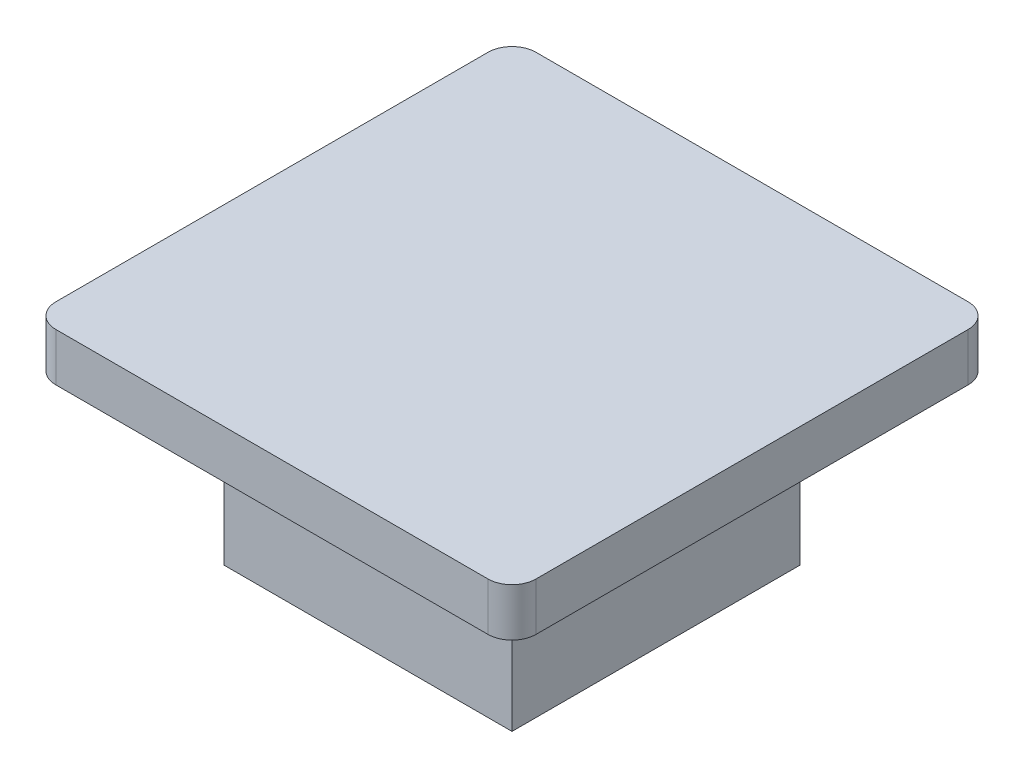
ISO-10303-21;
HEADER;
FILE_DESCRIPTION(('STEP AP214'),'2;1');
FILE_NAME('part.step','',(''),(''),'','','');
FILE_SCHEMA(('AUTOMOTIVE_DESIGN { 1 0 10303 214 1 1 1 1 }'));
ENDSEC;
DATA;
#1=APPLICATION_CONTEXT('core data for automotive mechanical design processes');
#2=APPLICATION_PROTOCOL_DEFINITION('international standard','automotive_design',2000,#1);
#3=PRODUCT_CONTEXT('',#1,'mechanical');
#4=PRODUCT('Part','Part','',(#3));
#5=PRODUCT_RELATED_PRODUCT_CATEGORY('part','',(#4));
#6=PRODUCT_DEFINITION_FORMATION('','',#4);
#7=PRODUCT_DEFINITION_CONTEXT('part definition',#1,'design');
#8=PRODUCT_DEFINITION('design','',#6,#7);
#9=PRODUCT_DEFINITION_SHAPE('','',#8);
#10=(LENGTH_UNIT() NAMED_UNIT(*) SI_UNIT(.MILLI.,.METRE.));
#11=(NAMED_UNIT(*) PLANE_ANGLE_UNIT() SI_UNIT($,.RADIAN.));
#12=(NAMED_UNIT(*) SI_UNIT($,.STERADIAN.) SOLID_ANGLE_UNIT());
#13=UNCERTAINTY_MEASURE_WITH_UNIT(LENGTH_MEASURE(1.E-05),#10,'distance_accuracy_value','');
#14=(GEOMETRIC_REPRESENTATION_CONTEXT(3) GLOBAL_UNCERTAINTY_ASSIGNED_CONTEXT((#13)) GLOBAL_UNIT_ASSIGNED_CONTEXT((#10,
#11,#12)) REPRESENTATION_CONTEXT('',''));
#15=CARTESIAN_POINT('',(0.,0.,0.));
#16=DIRECTION('',(0.,0.,1.));
#17=DIRECTION('',(1.,0.,0.));
#18=AXIS2_PLACEMENT_3D('',#15,#16,#17);
#19=CARTESIAN_POINT('',(100.,20.,100.));
#20=DIRECTION('',(-1.,0.,0.));
#21=DIRECTION('',(0.,0.,1.));
#22=AXIS2_PLACEMENT_3D('',#19,#20,#21);
#23=PLANE('',#22);
#24=DIRECTION('',(0.,0.,-1.));
#25=VECTOR('',#24,1.);
#26=CARTESIAN_POINT('',(100.,20.,100.));
#27=LINE('',#26,#25);
#28=CARTESIAN_POINT('',(100.,20.,90.));
#29=VERTEX_POINT('',#28);
#30=CARTESIAN_POINT('',(100.,20.,-90.));
#31=VERTEX_POINT('',#30);
#32=EDGE_CURVE('E229',#29,#31,#27,.T.);
#33=ORIENTED_EDGE('',*,*,#32,.F.);
#34=DIRECTION('',(0.,-1.,0.));
#35=VECTOR('',#34,1.);
#36=CARTESIAN_POINT('',(100.,20.,90.));
#37=LINE('',#36,#35);
#38=CARTESIAN_POINT('',(100.,0.,90.));
#39=VERTEX_POINT('',#38);
#40=EDGE_CURVE('E285',#29,#39,#37,.T.);
#41=ORIENTED_EDGE('',*,*,#40,.T.);
#42=DIRECTION('',(0.,0.,-1.));
#43=VECTOR('',#42,1.);
#44=CARTESIAN_POINT('',(100.,0.,100.));
#45=LINE('',#44,#43);
#46=CARTESIAN_POINT('',(100.,0.,-90.));
#47=VERTEX_POINT('',#46);
#48=EDGE_CURVE('E228',#39,#47,#45,.T.);
#49=ORIENTED_EDGE('',*,*,#48,.T.);
#50=DIRECTION('',(0.,-1.,0.));
#51=VECTOR('',#50,1.);
#52=CARTESIAN_POINT('',(100.,20.,-90.));
#53=LINE('',#52,#51);
#54=EDGE_CURVE('E283',#47,#31,#53,.F.);
#55=ORIENTED_EDGE('',*,*,#54,.T.);
#56=EDGE_LOOP('',(#33,#41,#49,#55));
#57=FACE_BOUND('',#56,.T.);
#58=ADVANCED_FACE('F37',(#57),#23,.F.);
#59=CARTESIAN_POINT('',(-100.,20.,-100.));
#60=DIRECTION('',(0.,0.,1.));
#61=DIRECTION('',(1.,0.,0.));
#62=AXIS2_PLACEMENT_3D('',#59,#60,#61);
#63=PLANE('',#62);
#64=DIRECTION('',(-1.,0.,0.));
#65=VECTOR('',#64,1.);
#66=CARTESIAN_POINT('',(-100.,0.,-100.));
#67=LINE('',#66,#65);
#68=CARTESIAN_POINT('',(90.,0.,-100.));
#69=VERTEX_POINT('',#68);
#70=CARTESIAN_POINT('',(-90.,0.,-100.));
#71=VERTEX_POINT('',#70);
#72=EDGE_CURVE('E245',#69,#71,#67,.T.);
#73=ORIENTED_EDGE('',*,*,#72,.T.);
#74=DIRECTION('',(0.,-1.,0.));
#75=VECTOR('',#74,1.);
#76=CARTESIAN_POINT('',(-90.,20.,-100.));
#77=LINE('',#76,#75);
#78=CARTESIAN_POINT('',(-90.,20.,-100.));
#79=VERTEX_POINT('',#78);
#80=EDGE_CURVE('E268',#71,#79,#77,.F.);
#81=ORIENTED_EDGE('',*,*,#80,.T.);
#82=DIRECTION('',(-1.,0.,0.));
#83=VECTOR('',#82,1.);
#84=CARTESIAN_POINT('',(-100.,20.,-100.));
#85=LINE('',#84,#83);
#86=CARTESIAN_POINT('',(90.,20.,-100.));
#87=VERTEX_POINT('',#86);
#88=EDGE_CURVE('E232',#87,#79,#85,.T.);
#89=ORIENTED_EDGE('',*,*,#88,.F.);
#90=DIRECTION('',(0.,-1.,0.));
#91=VECTOR('',#90,1.);
#92=CARTESIAN_POINT('',(90.,20.,-100.));
#93=LINE('',#92,#91);
#94=EDGE_CURVE('E265',#87,#69,#93,.T.);
#95=ORIENTED_EDGE('',*,*,#94,.T.);
#96=EDGE_LOOP('',(#73,#81,#89,#95));
#97=FACE_BOUND('',#96,.T.);
#98=ADVANCED_FACE('F354',(#97),#63,.F.);
#99=CARTESIAN_POINT('',(-100.,20.,100.));
#100=DIRECTION('',(1.,0.,0.));
#101=DIRECTION('',(0.,0.,-1.));
#102=AXIS2_PLACEMENT_3D('',#99,#100,#101);
#103=PLANE('',#102);
#104=DIRECTION('',(0.,0.,1.));
#105=VECTOR('',#104,1.);
#106=CARTESIAN_POINT('',(-100.,20.,100.));
#107=LINE('',#106,#105);
#108=CARTESIAN_POINT('',(-100.,20.,-90.));
#109=VERTEX_POINT('',#108);
#110=CARTESIAN_POINT('',(-100.,20.,90.));
#111=VERTEX_POINT('',#110);
#112=EDGE_CURVE('E236',#109,#111,#107,.T.);
#113=ORIENTED_EDGE('',*,*,#112,.F.);
#114=DIRECTION('',(0.,-1.,0.));
#115=VECTOR('',#114,1.);
#116=CARTESIAN_POINT('',(-100.,20.,-90.));
#117=LINE('',#116,#115);
#118=CARTESIAN_POINT('',(-100.,0.,-90.));
#119=VERTEX_POINT('',#118);
#120=EDGE_CURVE('E254',#109,#119,#117,.T.);
#121=ORIENTED_EDGE('',*,*,#120,.T.);
#122=DIRECTION('',(0.,0.,1.));
#123=VECTOR('',#122,1.);
#124=CARTESIAN_POINT('',(-100.,0.,100.));
#125=LINE('',#124,#123);
#126=CARTESIAN_POINT('',(-100.,0.,90.));
#127=VERTEX_POINT('',#126);
#128=EDGE_CURVE('E248',#119,#127,#125,.T.);
#129=ORIENTED_EDGE('',*,*,#128,.T.);
#130=DIRECTION('',(0.,-1.,0.));
#131=VECTOR('',#130,1.);
#132=CARTESIAN_POINT('',(-100.,20.,90.));
#133=LINE('',#132,#131);
#134=EDGE_CURVE('E242',#127,#111,#133,.F.);
#135=ORIENTED_EDGE('',*,*,#134,.T.);
#136=EDGE_LOOP('',(#113,#121,#129,#135));
#137=FACE_BOUND('',#136,.T.);
#138=ADVANCED_FACE('F360',(#137),#103,.F.);
#139=CARTESIAN_POINT('',(-100.,20.,100.));
#140=DIRECTION('',(0.,0.,-1.));
#141=DIRECTION('',(-1.,0.,0.));
#142=AXIS2_PLACEMENT_3D('',#139,#140,#141);
#143=PLANE('',#142);
#144=DIRECTION('',(1.,0.,0.));
#145=VECTOR('',#144,1.);
#146=CARTESIAN_POINT('',(-100.,20.,100.));
#147=LINE('',#146,#145);
#148=CARTESIAN_POINT('',(-90.,20.,100.));
#149=VERTEX_POINT('',#148);
#150=CARTESIAN_POINT('',(90.,20.,100.));
#151=VERTEX_POINT('',#150);
#152=EDGE_CURVE('E239',#149,#151,#147,.T.);
#153=ORIENTED_EDGE('',*,*,#152,.F.);
#154=DIRECTION('',(0.,-1.,0.));
#155=VECTOR('',#154,1.);
#156=CARTESIAN_POINT('',(-90.,20.,100.));
#157=LINE('',#156,#155);
#158=CARTESIAN_POINT('',(-90.,0.,100.));
#159=VERTEX_POINT('',#158);
#160=EDGE_CURVE('E280',#149,#159,#157,.T.);
#161=ORIENTED_EDGE('',*,*,#160,.T.);
#162=DIRECTION('',(1.,0.,0.));
#163=VECTOR('',#162,1.);
#164=CARTESIAN_POINT('',(-100.,0.,100.));
#165=LINE('',#164,#163);
#166=CARTESIAN_POINT('',(90.,0.,100.));
#167=VERTEX_POINT('',#166);
#168=EDGE_CURVE('E233',#159,#167,#165,.T.);
#169=ORIENTED_EDGE('',*,*,#168,.T.);
#170=DIRECTION('',(0.,-1.,0.));
#171=VECTOR('',#170,1.);
#172=CARTESIAN_POINT('',(90.,20.,100.));
#173=LINE('',#172,#171);
#174=EDGE_CURVE('E278',#167,#151,#173,.F.);
#175=ORIENTED_EDGE('',*,*,#174,.T.);
#176=EDGE_LOOP('',(#153,#161,#169,#175));
#177=FACE_BOUND('',#176,.T.);
#178=ADVANCED_FACE('F435',(#177),#143,.F.);
#179=CARTESIAN_POINT('',(0.,20.,0.));
#180=DIRECTION('',(0.,-1.,0.));
#181=DIRECTION('',(0.,0.,-1.));
#182=AXIS2_PLACEMENT_3D('',#179,#180,#181);
#183=PLANE('',#182);
#184=ORIENTED_EDGE('',*,*,#88,.T.);
#185=CARTESIAN_POINT('',(-90.,20.,-90.));
#186=DIRECTION('',(0.,-1.,0.));
#187=DIRECTION('',(0.,0.,-1.));
#188=AXIS2_PLACEMENT_3D('',#185,#186,#187);
#189=CIRCLE('',#188,10.);
#190=EDGE_CURVE('E276',#79,#109,#189,.F.);
#191=ORIENTED_EDGE('',*,*,#190,.T.);
#192=ORIENTED_EDGE('',*,*,#112,.T.);
#193=CARTESIAN_POINT('',(-90.,20.,90.));
#194=DIRECTION('',(0.,-1.,0.));
#195=DIRECTION('',(0.,0.,-1.));
#196=AXIS2_PLACEMENT_3D('',#193,#194,#195);
#197=CIRCLE('',#196,10.);
#198=EDGE_CURVE('E274',#111,#149,#197,.F.);
#199=ORIENTED_EDGE('',*,*,#198,.T.);
#200=ORIENTED_EDGE('',*,*,#152,.T.);
#201=CARTESIAN_POINT('',(90.,20.,90.));
#202=DIRECTION('',(0.,-1.,0.));
#203=DIRECTION('',(0.,0.,-1.));
#204=AXIS2_PLACEMENT_3D('',#201,#202,#203);
#205=CIRCLE('',#204,10.);
#206=EDGE_CURVE('E272',#151,#29,#205,.F.);
#207=ORIENTED_EDGE('',*,*,#206,.T.);
#208=ORIENTED_EDGE('',*,*,#32,.T.);
#209=CARTESIAN_POINT('',(90.,20.,-90.));
#210=DIRECTION('',(0.,-1.,0.));
#211=DIRECTION('',(0.,0.,-1.));
#212=AXIS2_PLACEMENT_3D('',#209,#210,#211);
#213=CIRCLE('',#212,10.);
#214=EDGE_CURVE('E270',#31,#87,#213,.F.);
#215=ORIENTED_EDGE('',*,*,#214,.T.);
#216=EDGE_LOOP('',(#184,#191,#192,#199,#200,#207,#208,#215));
#217=FACE_BOUND('',#216,.T.);
#218=ADVANCED_FACE('F432',(#217),#183,.F.);
#219=CARTESIAN_POINT('',(0.,0.,0.));
#220=DIRECTION('',(0.,-1.,0.));
#221=DIRECTION('',(0.,0.,-1.));
#222=AXIS2_PLACEMENT_3D('',#219,#220,#221);
#223=PLANE('',#222);
#224=DIRECTION('',(0.,0.,-1.));
#225=VECTOR('',#224,1.);
#226=CARTESIAN_POINT('',(-70.,0.,0.));
#227=LINE('',#226,#225);
#228=CARTESIAN_POINT('',(-70.,0.,-70.));
#229=VERTEX_POINT('',#228);
#230=CARTESIAN_POINT('',(-70.,0.,70.));
#231=VERTEX_POINT('',#230);
#232=EDGE_CURVE('E293',#229,#231,#227,.F.);
#233=ORIENTED_EDGE('',*,*,#232,.T.);
#234=DIRECTION('',(-1.,0.,0.));
#235=VECTOR('',#234,1.);
#236=CARTESIAN_POINT('',(0.,0.,70.));
#237=LINE('',#236,#235);
#238=CARTESIAN_POINT('',(70.,0.,70.));
#239=VERTEX_POINT('',#238);
#240=EDGE_CURVE('E297',#231,#239,#237,.F.);
#241=ORIENTED_EDGE('',*,*,#240,.T.);
#242=DIRECTION('',(0.,0.,1.));
#243=VECTOR('',#242,1.);
#244=CARTESIAN_POINT('',(70.,0.,0.));
#245=LINE('',#244,#243);
#246=CARTESIAN_POINT('',(70.,0.,-70.));
#247=VERTEX_POINT('',#246);
#248=EDGE_CURVE('E295',#239,#247,#245,.F.);
#249=ORIENTED_EDGE('',*,*,#248,.T.);
#250=DIRECTION('',(1.,0.,0.));
#251=VECTOR('',#250,1.);
#252=CARTESIAN_POINT('',(0.,0.,-70.));
#253=LINE('',#252,#251);
#254=EDGE_CURVE('E291',#247,#229,#253,.F.);
#255=ORIENTED_EDGE('',*,*,#254,.T.);
#256=EDGE_LOOP('',(#233,#241,#249,#255));
#257=FACE_BOUND('',#256,.T.);
#258=ORIENTED_EDGE('',*,*,#128,.F.);
#259=CARTESIAN_POINT('',(-90.,0.,-90.));
#260=DIRECTION('',(0.,-1.,0.));
#261=DIRECTION('',(0.,0.,-1.));
#262=AXIS2_PLACEMENT_3D('',#259,#260,#261);
#263=CIRCLE('',#262,10.);
#264=EDGE_CURVE('E263',#119,#71,#263,.T.);
#265=ORIENTED_EDGE('',*,*,#264,.T.);
#266=ORIENTED_EDGE('',*,*,#72,.F.);
#267=CARTESIAN_POINT('',(90.,0.,-90.));
#268=DIRECTION('',(0.,-1.,0.));
#269=DIRECTION('',(0.,0.,-1.));
#270=AXIS2_PLACEMENT_3D('',#267,#268,#269);
#271=CIRCLE('',#270,10.);
#272=EDGE_CURVE('E257',#69,#47,#271,.T.);
#273=ORIENTED_EDGE('',*,*,#272,.T.);
#274=ORIENTED_EDGE('',*,*,#48,.F.);
#275=CARTESIAN_POINT('',(90.,0.,90.));
#276=DIRECTION('',(0.,-1.,0.));
#277=DIRECTION('',(0.,0.,-1.));
#278=AXIS2_PLACEMENT_3D('',#275,#276,#277);
#279=CIRCLE('',#278,10.);
#280=EDGE_CURVE('E259',#39,#167,#279,.T.);
#281=ORIENTED_EDGE('',*,*,#280,.T.);
#282=ORIENTED_EDGE('',*,*,#168,.F.);
#283=CARTESIAN_POINT('',(-90.,0.,90.));
#284=DIRECTION('',(0.,-1.,0.));
#285=DIRECTION('',(0.,0.,-1.));
#286=AXIS2_PLACEMENT_3D('',#283,#284,#285);
#287=CIRCLE('',#286,10.);
#288=EDGE_CURVE('E261',#159,#127,#287,.T.);
#289=ORIENTED_EDGE('',*,*,#288,.T.);
#290=EDGE_LOOP('',(#258,#265,#266,#273,#274,#281,#282,#289));
#291=FACE_BOUND('',#290,.T.);
#292=ADVANCED_FACE('F400',(#257,#291),#223,.T.);
#293=CARTESIAN_POINT('',(60.,-70.,-60.));
#294=DIRECTION('',(-1.,0.,0.));
#295=DIRECTION('',(0.,0.,1.));
#296=AXIS2_PLACEMENT_3D('',#293,#294,#295);
#297=PLANE('',#296);
#298=DIRECTION('',(0.,1.,0.));
#299=VECTOR('',#298,1.);
#300=CARTESIAN_POINT('',(60.,-70.,-60.));
#301=LINE('',#300,#299);
#302=CARTESIAN_POINT('',(60.,-70.,-60.));
#303=VERTEX_POINT('',#302);
#304=CARTESIAN_POINT('',(60.,-10.,-60.));
#305=VERTEX_POINT('',#304);
#306=EDGE_CURVE('E219',#303,#305,#301,.T.);
#307=ORIENTED_EDGE('',*,*,#306,.T.);
#308=DIRECTION('',(0.,0.,1.));
#309=VECTOR('',#308,1.);
#310=CARTESIAN_POINT('',(60.,-10.,-60.));
#311=LINE('',#310,#309);
#312=CARTESIAN_POINT('',(60.,-10.,60.));
#313=VERTEX_POINT('',#312);
#314=EDGE_CURVE('E300',#305,#313,#311,.T.);
#315=ORIENTED_EDGE('',*,*,#314,.T.);
#316=DIRECTION('',(0.,1.,0.));
#317=VECTOR('',#316,1.);
#318=CARTESIAN_POINT('',(60.,-70.,60.));
#319=LINE('',#318,#317);
#320=CARTESIAN_POINT('',(60.,-70.,60.));
#321=VERTEX_POINT('',#320);
#322=EDGE_CURVE('E225',#321,#313,#319,.T.);
#323=ORIENTED_EDGE('',*,*,#322,.F.);
#324=DIRECTION('',(0.,0.,1.));
#325=VECTOR('',#324,1.);
#326=CARTESIAN_POINT('',(60.,-70.,-60.));
#327=LINE('',#326,#325);
#328=EDGE_CURVE('E207',#303,#321,#327,.T.);
#329=ORIENTED_EDGE('',*,*,#328,.F.);
#330=EDGE_LOOP('',(#307,#315,#323,#329));
#331=FACE_BOUND('',#330,.T.);
#332=ADVANCED_FACE('F406',(#331),#297,.F.);
#333=CARTESIAN_POINT('',(-60.,-70.,60.));
#334=DIRECTION('',(0.,0.,-1.));
#335=DIRECTION('',(-1.,0.,0.));
#336=AXIS2_PLACEMENT_3D('',#333,#334,#335);
#337=PLANE('',#336);
#338=ORIENTED_EDGE('',*,*,#322,.T.);
#339=DIRECTION('',(-1.,0.,0.));
#340=VECTOR('',#339,1.);
#341=CARTESIAN_POINT('',(-60.,-10.,60.));
#342=LINE('',#341,#340);
#343=CARTESIAN_POINT('',(-60.,-10.,60.));
#344=VERTEX_POINT('',#343);
#345=EDGE_CURVE('E288',#313,#344,#342,.T.);
#346=ORIENTED_EDGE('',*,*,#345,.T.);
#347=DIRECTION('',(0.,1.,0.));
#348=VECTOR('',#347,1.);
#349=CARTESIAN_POINT('',(-60.,-70.,60.));
#350=LINE('',#349,#348);
#351=CARTESIAN_POINT('',(-60.,-70.,60.));
#352=VERTEX_POINT('',#351);
#353=EDGE_CURVE('E223',#352,#344,#350,.T.);
#354=ORIENTED_EDGE('',*,*,#353,.F.);
#355=DIRECTION('',(-1.,0.,0.));
#356=VECTOR('',#355,1.);
#357=CARTESIAN_POINT('',(-60.,-70.,60.));
#358=LINE('',#357,#356);
#359=EDGE_CURVE('E213',#321,#352,#358,.T.);
#360=ORIENTED_EDGE('',*,*,#359,.F.);
#361=EDGE_LOOP('',(#338,#346,#354,#360));
#362=FACE_BOUND('',#361,.T.);
#363=ADVANCED_FACE('F409',(#362),#337,.F.);
#364=CARTESIAN_POINT('',(-60.,-70.,-60.));
#365=DIRECTION('',(1.,0.,0.));
#366=DIRECTION('',(0.,0.,-1.));
#367=AXIS2_PLACEMENT_3D('',#364,#365,#366);
#368=PLANE('',#367);
#369=ORIENTED_EDGE('',*,*,#353,.T.);
#370=DIRECTION('',(0.,0.,-1.));
#371=VECTOR('',#370,1.);
#372=CARTESIAN_POINT('',(-60.,-10.,-60.));
#373=LINE('',#372,#371);
#374=CARTESIAN_POINT('',(-60.,-10.,-60.));
#375=VERTEX_POINT('',#374);
#376=EDGE_CURVE('E46',#344,#375,#373,.T.);
#377=ORIENTED_EDGE('',*,*,#376,.T.);
#378=DIRECTION('',(0.,1.,0.));
#379=VECTOR('',#378,1.);
#380=CARTESIAN_POINT('',(-60.,-70.,-60.));
#381=LINE('',#380,#379);
#382=CARTESIAN_POINT('',(-60.,-70.,-60.));
#383=VERTEX_POINT('',#382);
#384=EDGE_CURVE('E221',#383,#375,#381,.T.);
#385=ORIENTED_EDGE('',*,*,#384,.F.);
#386=DIRECTION('',(0.,0.,-1.));
#387=VECTOR('',#386,1.);
#388=CARTESIAN_POINT('',(-60.,-70.,-60.));
#389=LINE('',#388,#387);
#390=EDGE_CURVE('E215',#352,#383,#389,.T.);
#391=ORIENTED_EDGE('',*,*,#390,.F.);
#392=EDGE_LOOP('',(#369,#377,#385,#391));
#393=FACE_BOUND('',#392,.T.);
#394=ADVANCED_FACE('F417',(#393),#368,.F.);
#395=CARTESIAN_POINT('',(-60.,-70.,-60.));
#396=DIRECTION('',(0.,0.,1.));
#397=DIRECTION('',(1.,0.,0.));
#398=AXIS2_PLACEMENT_3D('',#395,#396,#397);
#399=PLANE('',#398);
#400=ORIENTED_EDGE('',*,*,#384,.T.);
#401=DIRECTION('',(1.,0.,0.));
#402=VECTOR('',#401,1.);
#403=CARTESIAN_POINT('',(-60.,-10.,-60.));
#404=LINE('',#403,#402);
#405=EDGE_CURVE('E11',#375,#305,#404,.T.);
#406=ORIENTED_EDGE('',*,*,#405,.T.);
#407=ORIENTED_EDGE('',*,*,#306,.F.);
#408=DIRECTION('',(1.,0.,0.));
#409=VECTOR('',#408,1.);
#410=CARTESIAN_POINT('',(-60.,-70.,-60.));
#411=LINE('',#410,#409);
#412=EDGE_CURVE('E217',#383,#303,#411,.T.);
#413=ORIENTED_EDGE('',*,*,#412,.F.);
#414=EDGE_LOOP('',(#400,#406,#407,#413));
#415=FACE_BOUND('',#414,.T.);
#416=ADVANCED_FACE('F415',(#415),#399,.F.);
#417=CARTESIAN_POINT('',(0.,-70.,0.));
#418=DIRECTION('',(0.,1.,0.));
#419=DIRECTION('',(0.,0.,1.));
#420=AXIS2_PLACEMENT_3D('',#417,#418,#419);
#421=PLANE('',#420);
#422=DIRECTION('',(0.826797284707684,0.,0.5625));
#423=VECTOR('',#422,1.);
#424=CARTESIAN_POINT('',(3.64789313600534,-70.,-28.937904964769));
#425=LINE('',#424,#423);
#426=CARTESIAN_POINT('',(3.64789313600534,-70.,-28.937904964769));
#427=VERTEX_POINT('',#426);
#428=CARTESIAN_POINT('',(30.9916431360053,-70.,-10.3349660588461));
#429=VERTEX_POINT('',#428);
#430=EDGE_CURVE('E200',#427,#429,#425,.T.);
#431=ORIENTED_EDGE('',*,*,#430,.F.);
#432=CARTESIAN_POINT('',(-16.0396068639947,-70.,0.));
#433=DIRECTION('',(0.,-1.,0.));
#434=DIRECTION('',(0.,0.,-1.));
#435=AXIS2_PLACEMENT_3D('',#432,#433,#434);
#436=CIRCLE('',#435,35.);
#437=CARTESIAN_POINT('',(3.64789313600534,-70.,28.937904964769));
#438=VERTEX_POINT('',#437);
#439=EDGE_CURVE('E171',#438,#427,#436,.T.);
#440=ORIENTED_EDGE('',*,*,#439,.F.);
#441=DIRECTION('',(-0.826797284707684,0.,0.5625));
#442=VECTOR('',#441,1.);
#443=CARTESIAN_POINT('',(3.64789313600534,-70.,28.937904964769));
#444=LINE('',#443,#442);
#445=CARTESIAN_POINT('',(30.9916431360053,-70.,10.3349660588461));
#446=VERTEX_POINT('',#445);
#447=EDGE_CURVE('E188',#446,#438,#444,.T.);
#448=ORIENTED_EDGE('',*,*,#447,.F.);
#449=CARTESIAN_POINT('',(23.9603931360053,-70.,0.));
#450=DIRECTION('',(0.,-1.,0.));
#451=DIRECTION('',(0.,0.,-1.));
#452=AXIS2_PLACEMENT_3D('',#449,#450,#451);
#453=CIRCLE('',#452,12.5);
#454=EDGE_CURVE('E191',#429,#446,#453,.T.);
#455=ORIENTED_EDGE('',*,*,#454,.F.);
#456=EDGE_LOOP('',(#431,#440,#448,#455));
#457=FACE_BOUND('',#456,.T.);
#458=ORIENTED_EDGE('',*,*,#328,.T.);
#459=ORIENTED_EDGE('',*,*,#359,.T.);
#460=ORIENTED_EDGE('',*,*,#390,.T.);
#461=ORIENTED_EDGE('',*,*,#412,.T.);
#462=EDGE_LOOP('',(#458,#459,#460,#461));
#463=FACE_BOUND('',#462,.T.);
#464=ADVANCED_FACE('F413',(#457,#463),#421,.F.);
#465=CARTESIAN_POINT('',(-16.0396068639947,-50.,0.));
#466=DIRECTION('',(0.,-1.,0.));
#467=DIRECTION('',(0.,0.,-1.));
#468=AXIS2_PLACEMENT_3D('',#465,#466,#467);
#469=CYLINDRICAL_SURFACE('',#468,35.);
#470=ORIENTED_EDGE('',*,*,#439,.T.);
#471=DIRECTION('',(0.,-1.,0.));
#472=VECTOR('',#471,1.);
#473=CARTESIAN_POINT('',(3.64789313600534,-50.,-28.937904964769));
#474=LINE('',#473,#472);
#475=CARTESIAN_POINT('',(3.64789313600534,-50.,-28.937904964769));
#476=VERTEX_POINT('',#475);
#477=EDGE_CURVE('E164',#476,#427,#474,.T.);
#478=ORIENTED_EDGE('',*,*,#477,.F.);
#479=CARTESIAN_POINT('',(-16.0396068639947,-50.,0.));
#480=DIRECTION('',(0.,-1.,0.));
#481=DIRECTION('',(0.,0.,-1.));
#482=AXIS2_PLACEMENT_3D('',#479,#480,#481);
#483=CIRCLE('',#482,35.);
#484=CARTESIAN_POINT('',(3.64789313600534,-50.,28.937904964769));
#485=VERTEX_POINT('',#484);
#486=EDGE_CURVE('E168',#485,#476,#483,.T.);
#487=ORIENTED_EDGE('',*,*,#486,.F.);
#488=DIRECTION('',(0.,-1.,0.));
#489=VECTOR('',#488,1.);
#490=CARTESIAN_POINT('',(3.64789313600534,-50.,28.937904964769));
#491=LINE('',#490,#489);
#492=EDGE_CURVE('E205',#485,#438,#491,.T.);
#493=ORIENTED_EDGE('',*,*,#492,.T.);
#494=EDGE_LOOP('',(#470,#478,#487,#493));
#495=FACE_BOUND('',#494,.T.);
#496=ADVANCED_FACE('F166',(#495),#469,.F.);
#497=CARTESIAN_POINT('',(3.64789313600534,-50.,28.937904964769));
#498=DIRECTION('',(0.5625,0.,0.826797284707684));
#499=DIRECTION('',(0.826797284707684,0.,-0.5625));
#500=AXIS2_PLACEMENT_3D('',#497,#498,#499);
#501=PLANE('',#500);
#502=ORIENTED_EDGE('',*,*,#447,.T.);
#503=ORIENTED_EDGE('',*,*,#492,.F.);
#504=DIRECTION('',(-0.826797284707684,0.,0.5625));
#505=VECTOR('',#504,1.);
#506=CARTESIAN_POINT('',(3.64789313600534,-50.,28.937904964769));
#507=LINE('',#506,#505);
#508=CARTESIAN_POINT('',(30.9916431360053,-50.,10.3349660588461));
#509=VERTEX_POINT('',#508);
#510=EDGE_CURVE('E176',#509,#485,#507,.T.);
#511=ORIENTED_EDGE('',*,*,#510,.F.);
#512=DIRECTION('',(0.,-1.,0.));
#513=VECTOR('',#512,1.);
#514=CARTESIAN_POINT('',(30.9916431360053,-50.,10.3349660588461));
#515=LINE('',#514,#513);
#516=EDGE_CURVE('E208',#509,#446,#515,.T.);
#517=ORIENTED_EDGE('',*,*,#516,.T.);
#518=EDGE_LOOP('',(#502,#503,#511,#517));
#519=FACE_BOUND('',#518,.T.);
#520=ADVANCED_FACE('F596',(#519),#501,.F.);
#521=CARTESIAN_POINT('',(23.9603931360053,-50.,0.));
#522=DIRECTION('',(0.,-1.,0.));
#523=DIRECTION('',(0.,0.,-1.));
#524=AXIS2_PLACEMENT_3D('',#521,#522,#523);
#525=CYLINDRICAL_SURFACE('',#524,12.5);
#526=ORIENTED_EDGE('',*,*,#454,.T.);
#527=ORIENTED_EDGE('',*,*,#516,.F.);
#528=CARTESIAN_POINT('',(23.9603931360053,-50.,0.));
#529=DIRECTION('',(0.,-1.,0.));
#530=DIRECTION('',(0.,0.,-1.));
#531=AXIS2_PLACEMENT_3D('',#528,#529,#530);
#532=CIRCLE('',#531,12.5);
#533=CARTESIAN_POINT('',(30.9916431360053,-50.,-10.3349660588461));
#534=VERTEX_POINT('',#533);
#535=EDGE_CURVE('E184',#534,#509,#532,.T.);
#536=ORIENTED_EDGE('',*,*,#535,.F.);
#537=DIRECTION('',(0.,-1.,0.));
#538=VECTOR('',#537,1.);
#539=CARTESIAN_POINT('',(30.9916431360053,-50.,-10.3349660588461));
#540=LINE('',#539,#538);
#541=EDGE_CURVE('E175',#534,#429,#540,.T.);
#542=ORIENTED_EDGE('',*,*,#541,.T.);
#543=EDGE_LOOP('',(#526,#527,#536,#542));
#544=FACE_BOUND('',#543,.T.);
#545=ADVANCED_FACE('F349',(#544),#525,.F.);
#546=CARTESIAN_POINT('',(3.64789313600534,-50.,-28.937904964769));
#547=DIRECTION('',(0.5625,0.,-0.826797284707684));
#548=DIRECTION('',(-0.826797284707684,0.,-0.5625));
#549=AXIS2_PLACEMENT_3D('',#546,#547,#548);
#550=PLANE('',#549);
#551=ORIENTED_EDGE('',*,*,#430,.T.);
#552=ORIENTED_EDGE('',*,*,#541,.F.);
#553=DIRECTION('',(0.826797284707684,0.,0.5625));
#554=VECTOR('',#553,1.);
#555=CARTESIAN_POINT('',(3.64789313600534,-50.,-28.937904964769));
#556=LINE('',#555,#554);
#557=EDGE_CURVE('E179',#476,#534,#556,.T.);
#558=ORIENTED_EDGE('',*,*,#557,.F.);
#559=ORIENTED_EDGE('',*,*,#477,.T.);
#560=EDGE_LOOP('',(#551,#552,#558,#559));
#561=FACE_BOUND('',#560,.T.);
#562=ADVANCED_FACE('F180',(#561),#550,.F.);
#563=CARTESIAN_POINT('',(-16.0396068639947,-50.,0.));
#564=DIRECTION('',(0.,-1.,0.));
#565=DIRECTION('',(0.,0.,-1.));
#566=AXIS2_PLACEMENT_3D('',#563,#564,#565);
#567=PLANE('',#566);
#568=CARTESIAN_POINT('',(-16.0396068639947,-50.,0.));
#569=DIRECTION('',(0.,-1.,0.));
#570=DIRECTION('',(0.,0.,-1.));
#571=AXIS2_PLACEMENT_3D('',#568,#569,#570);
#572=CIRCLE('',#571,16.);
#573=CARTESIAN_POINT('',(-16.0396068639947,-50.,-16.));
#574=VERTEX_POINT('',#573);
#575=EDGE_CURVE('E321',#574,#574,#572,.T.);
#576=ORIENTED_EDGE('',*,*,#575,.F.);
#577=EDGE_LOOP('',(#576));
#578=FACE_BOUND('',#577,.T.);
#579=CARTESIAN_POINT('',(23.9603931360054,-50.,0.));
#580=DIRECTION('',(0.,-1.,0.));
#581=DIRECTION('',(0.,0.,-1.));
#582=AXIS2_PLACEMENT_3D('',#579,#580,#581);
#583=CIRCLE('',#582,11.0000000000007);
#584=CARTESIAN_POINT('',(23.9603931360054,-50.,-11.0000000000007));
#585=VERTEX_POINT('',#584);
#586=EDGE_CURVE('E317',#585,#585,#583,.T.);
#587=ORIENTED_EDGE('',*,*,#586,.F.);
#588=EDGE_LOOP('',(#587));
#589=FACE_BOUND('',#588,.T.);
#590=ORIENTED_EDGE('',*,*,#486,.T.);
#591=ORIENTED_EDGE('',*,*,#557,.T.);
#592=ORIENTED_EDGE('',*,*,#535,.T.);
#593=ORIENTED_EDGE('',*,*,#510,.T.);
#594=EDGE_LOOP('',(#590,#591,#592,#593));
#595=FACE_BOUND('',#594,.T.);
#596=ADVANCED_FACE('F186',(#578,#589,#595),#567,.T.);
#597=CARTESIAN_POINT('',(23.9603931360054,-40.,0.));
#598=DIRECTION('',(0.,-1.,0.));
#599=DIRECTION('',(0.,0.,-1.));
#600=AXIS2_PLACEMENT_3D('',#597,#598,#599);
#601=CYLINDRICAL_SURFACE('',#600,11.0000000000007);
#602=CARTESIAN_POINT('',(23.9603931360054,-40.,0.));
#603=DIRECTION('',(0.,-1.,0.));
#604=DIRECTION('',(0.,0.,-1.));
#605=AXIS2_PLACEMENT_3D('',#602,#603,#604);
#606=CIRCLE('',#605,11.0000000000007);
#607=CARTESIAN_POINT('',(23.9603931360054,-40.,-11.0000000000007));
#608=VERTEX_POINT('',#607);
#609=EDGE_CURVE('E194',#608,#608,#606,.T.);
#610=ORIENTED_EDGE('',*,*,#609,.F.);
#611=EDGE_LOOP('',(#610));
#612=FACE_BOUND('',#611,.T.);
#613=ORIENTED_EDGE('',*,*,#586,.T.);
#614=EDGE_LOOP('',(#613));
#615=FACE_BOUND('',#614,.T.);
#616=ADVANCED_FACE('F341',(#612,#615),#601,.F.);
#617=CARTESIAN_POINT('',(23.9603931360054,-40.,0.));
#618=DIRECTION('',(0.,-1.,0.));
#619=DIRECTION('',(0.,0.,-1.));
#620=AXIS2_PLACEMENT_3D('',#617,#618,#619);
#621=PLANE('',#620);
#622=ORIENTED_EDGE('',*,*,#609,.T.);
#623=EDGE_LOOP('',(#622));
#624=FACE_BOUND('',#623,.T.);
#625=ADVANCED_FACE('F335',(#624),#621,.T.);
#626=CARTESIAN_POINT('',(-16.0396068639947,-40.,0.));
#627=DIRECTION('',(0.,-1.,0.));
#628=DIRECTION('',(0.,0.,-1.));
#629=AXIS2_PLACEMENT_3D('',#626,#627,#628);
#630=CYLINDRICAL_SURFACE('',#629,16.);
#631=CARTESIAN_POINT('',(-16.0396068639947,-40.,0.));
#632=DIRECTION('',(0.,-1.,0.));
#633=DIRECTION('',(0.,0.,-1.));
#634=AXIS2_PLACEMENT_3D('',#631,#632,#633);
#635=CIRCLE('',#634,16.);
#636=CARTESIAN_POINT('',(-16.0396068639947,-40.,-16.));
#637=VERTEX_POINT('',#636);
#638=EDGE_CURVE('E201',#637,#637,#635,.T.);
#639=ORIENTED_EDGE('',*,*,#638,.F.);
#640=EDGE_LOOP('',(#639));
#641=FACE_BOUND('',#640,.T.);
#642=ORIENTED_EDGE('',*,*,#575,.T.);
#643=EDGE_LOOP('',(#642));
#644=FACE_BOUND('',#643,.T.);
#645=ADVANCED_FACE('F332',(#641,#644),#630,.F.);
#646=CARTESIAN_POINT('',(-16.0396068639947,-40.,0.));
#647=DIRECTION('',(0.,-1.,0.));
#648=DIRECTION('',(0.,0.,-1.));
#649=AXIS2_PLACEMENT_3D('',#646,#647,#648);
#650=PLANE('',#649);
#651=ORIENTED_EDGE('',*,*,#638,.T.);
#652=EDGE_LOOP('',(#651));
#653=FACE_BOUND('',#652,.T.);
#654=ADVANCED_FACE('F330',(#653),#650,.T.);
#655=CARTESIAN_POINT('',(-90.,20.,-90.));
#656=DIRECTION('',(0.,-1.,0.));
#657=DIRECTION('',(0.,0.,-1.));
#658=AXIS2_PLACEMENT_3D('',#655,#656,#657);
#659=CYLINDRICAL_SURFACE('',#658,10.);
#660=ORIENTED_EDGE('',*,*,#190,.F.);
#661=ORIENTED_EDGE('',*,*,#80,.F.);
#662=ORIENTED_EDGE('',*,*,#264,.F.);
#663=ORIENTED_EDGE('',*,*,#120,.F.);
#664=EDGE_LOOP('',(#660,#661,#662,#663));
#665=FACE_BOUND('',#664,.T.);
#666=ADVANCED_FACE('F366',(#665),#659,.T.);
#667=CARTESIAN_POINT('',(-90.,20.,90.));
#668=DIRECTION('',(0.,-1.,0.));
#669=DIRECTION('',(0.,0.,-1.));
#670=AXIS2_PLACEMENT_3D('',#667,#668,#669);
#671=CYLINDRICAL_SURFACE('',#670,10.);
#672=ORIENTED_EDGE('',*,*,#198,.F.);
#673=ORIENTED_EDGE('',*,*,#134,.F.);
#674=ORIENTED_EDGE('',*,*,#288,.F.);
#675=ORIENTED_EDGE('',*,*,#160,.F.);
#676=EDGE_LOOP('',(#672,#673,#674,#675));
#677=FACE_BOUND('',#676,.T.);
#678=ADVANCED_FACE('F369',(#677),#671,.T.);
#679=CARTESIAN_POINT('',(90.,20.,90.));
#680=DIRECTION('',(0.,-1.,0.));
#681=DIRECTION('',(0.,0.,-1.));
#682=AXIS2_PLACEMENT_3D('',#679,#680,#681);
#683=CYLINDRICAL_SURFACE('',#682,10.);
#684=ORIENTED_EDGE('',*,*,#206,.F.);
#685=ORIENTED_EDGE('',*,*,#174,.F.);
#686=ORIENTED_EDGE('',*,*,#280,.F.);
#687=ORIENTED_EDGE('',*,*,#40,.F.);
#688=EDGE_LOOP('',(#684,#685,#686,#687));
#689=FACE_BOUND('',#688,.T.);
#690=ADVANCED_FACE('F373',(#689),#683,.T.);
#691=CARTESIAN_POINT('',(90.,20.,-90.));
#692=DIRECTION('',(0.,-1.,0.));
#693=DIRECTION('',(0.,0.,-1.));
#694=AXIS2_PLACEMENT_3D('',#691,#692,#693);
#695=CYLINDRICAL_SURFACE('',#694,10.);
#696=ORIENTED_EDGE('',*,*,#214,.F.);
#697=ORIENTED_EDGE('',*,*,#54,.F.);
#698=ORIENTED_EDGE('',*,*,#272,.F.);
#699=ORIENTED_EDGE('',*,*,#94,.F.);
#700=EDGE_LOOP('',(#696,#697,#698,#699));
#701=FACE_BOUND('',#700,.T.);
#702=ADVANCED_FACE('F377',(#701),#695,.T.);
#703=CARTESIAN_POINT('',(-60.,-10.,-70.));
#704=DIRECTION('',(1.,0.,0.));
#705=DIRECTION('',(0.,0.,-1.));
#706=AXIS2_PLACEMENT_3D('',#703,#704,#705);
#707=CYLINDRICAL_SURFACE('',#706,10.);
#708=CARTESIAN_POINT('',(-70.,-10.,-70.));
#709=DIRECTION('',(0.707106781186547,0.,-0.707106781186547));
#710=DIRECTION('',(0.707106781186547,0.,0.707106781186547));
#711=AXIS2_PLACEMENT_3D('',#708,#709,#710);
#712=ELLIPSE('',#711,14.1421356237309,10.);
#713=EDGE_CURVE('E306',#229,#375,#712,.T.);
#714=ORIENTED_EDGE('',*,*,#713,.F.);
#715=ORIENTED_EDGE('',*,*,#254,.F.);
#716=CARTESIAN_POINT('',(70.,-10.,-70.));
#717=DIRECTION('',(0.707106781186547,0.,0.707106781186547));
#718=DIRECTION('',(0.707106781186547,0.,-0.707106781186547));
#719=AXIS2_PLACEMENT_3D('',#716,#717,#718);
#720=ELLIPSE('',#719,14.1421356237309,10.);
#721=EDGE_CURVE('E41',#305,#247,#720,.F.);
#722=ORIENTED_EDGE('',*,*,#721,.F.);
#723=ORIENTED_EDGE('',*,*,#405,.F.);
#724=EDGE_LOOP('',(#714,#715,#722,#723));
#725=FACE_BOUND('',#724,.T.);
#726=ADVANCED_FACE('F39',(#725),#707,.F.);
#727=CARTESIAN_POINT('',(70.,-10.,-60.));
#728=DIRECTION('',(0.,0.,1.));
#729=DIRECTION('',(1.,0.,0.));
#730=AXIS2_PLACEMENT_3D('',#727,#728,#729);
#731=CYLINDRICAL_SURFACE('',#730,10.);
#732=ORIENTED_EDGE('',*,*,#721,.T.);
#733=ORIENTED_EDGE('',*,*,#248,.F.);
#734=CARTESIAN_POINT('',(70.,-10.,70.));
#735=DIRECTION('',(-0.707106781186547,0.,0.707106781186547));
#736=DIRECTION('',(0.707106781186547,0.,0.707106781186547));
#737=AXIS2_PLACEMENT_3D('',#734,#735,#736);
#738=ELLIPSE('',#737,14.1421356237309,10.);
#739=EDGE_CURVE('E305',#313,#239,#738,.F.);
#740=ORIENTED_EDGE('',*,*,#739,.F.);
#741=ORIENTED_EDGE('',*,*,#314,.F.);
#742=EDGE_LOOP('',(#732,#733,#740,#741));
#743=FACE_BOUND('',#742,.T.);
#744=ADVANCED_FACE('F388',(#743),#731,.F.);
#745=CARTESIAN_POINT('',(-70.,-10.,-60.));
#746=DIRECTION('',(0.,0.,-1.));
#747=DIRECTION('',(-1.,0.,0.));
#748=AXIS2_PLACEMENT_3D('',#745,#746,#747);
#749=CYLINDRICAL_SURFACE('',#748,10.);
#750=ORIENTED_EDGE('',*,*,#713,.T.);
#751=ORIENTED_EDGE('',*,*,#376,.F.);
#752=CARTESIAN_POINT('',(-70.,-10.,70.));
#753=DIRECTION('',(-0.707106781186547,0.,-0.707106781186547));
#754=DIRECTION('',(0.707106781186547,0.,-0.707106781186547));
#755=AXIS2_PLACEMENT_3D('',#752,#753,#754);
#756=ELLIPSE('',#755,14.1421356237309,10.);
#757=EDGE_CURVE('E303',#231,#344,#756,.T.);
#758=ORIENTED_EDGE('',*,*,#757,.F.);
#759=ORIENTED_EDGE('',*,*,#232,.F.);
#760=EDGE_LOOP('',(#750,#751,#758,#759));
#761=FACE_BOUND('',#760,.T.);
#762=ADVANCED_FACE('F385',(#761),#749,.F.);
#763=CARTESIAN_POINT('',(-60.,-10.,70.));
#764=DIRECTION('',(-1.,0.,0.));
#765=DIRECTION('',(0.,0.,1.));
#766=AXIS2_PLACEMENT_3D('',#763,#764,#765);
#767=CYLINDRICAL_SURFACE('',#766,10.);
#768=ORIENTED_EDGE('',*,*,#739,.T.);
#769=ORIENTED_EDGE('',*,*,#240,.F.);
#770=ORIENTED_EDGE('',*,*,#757,.T.);
#771=ORIENTED_EDGE('',*,*,#345,.F.);
#772=EDGE_LOOP('',(#768,#769,#770,#771));
#773=FACE_BOUND('',#772,.T.);
#774=ADVANCED_FACE('F382',(#773),#767,.F.);
#775=CLOSED_SHELL('',(#58,#98,#138,#178,#218,#292,#332,#363,#394,#416,#464,#496,#520,#545,#562,
#596,#616,#625,#645,#654,#666,#678,#690,#702,#726,#744,#762,#774));
#776=MANIFOLD_SOLID_BREP('B2',#775);
#777=ADVANCED_BREP_SHAPE_REPRESENTATION('',(#18,#776),#14);
#778=SHAPE_DEFINITION_REPRESENTATION(#9,#777);
ENDSEC;
END-ISO-10303-21;
